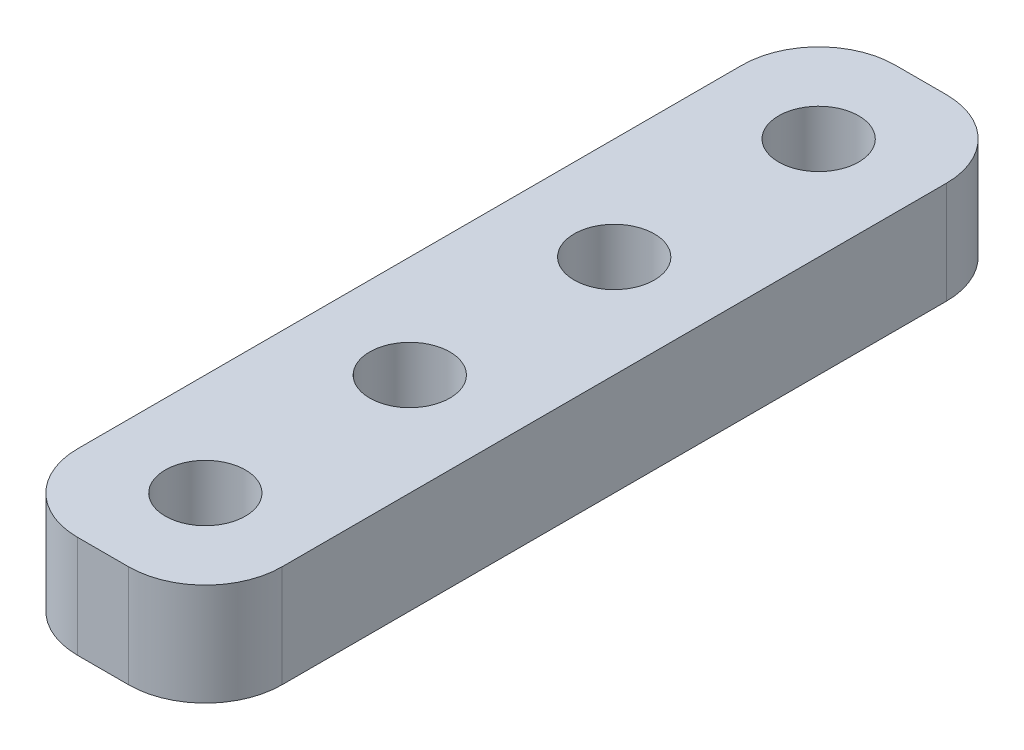
ISO-10303-21;
HEADER;
FILE_DESCRIPTION(('STEP AP214'),'2;1');
FILE_NAME('part.step','',(''),(''),'','','');
FILE_SCHEMA(('AUTOMOTIVE_DESIGN { 1 0 10303 214 1 1 1 1 }'));
ENDSEC;
DATA;
#1=APPLICATION_CONTEXT('core data for automotive mechanical design processes');
#2=APPLICATION_PROTOCOL_DEFINITION('international standard','automotive_design',2000,#1);
#3=PRODUCT_CONTEXT('',#1,'mechanical');
#4=PRODUCT('Part','Part','',(#3));
#5=PRODUCT_RELATED_PRODUCT_CATEGORY('part','',(#4));
#6=PRODUCT_DEFINITION_FORMATION('','',#4);
#7=PRODUCT_DEFINITION_CONTEXT('part definition',#1,'design');
#8=PRODUCT_DEFINITION('design','',#6,#7);
#9=PRODUCT_DEFINITION_SHAPE('','',#8);
#10=(LENGTH_UNIT() NAMED_UNIT(*) SI_UNIT(.MILLI.,.METRE.));
#11=(NAMED_UNIT(*) PLANE_ANGLE_UNIT() SI_UNIT($,.RADIAN.));
#12=(NAMED_UNIT(*) SI_UNIT($,.STERADIAN.) SOLID_ANGLE_UNIT());
#13=UNCERTAINTY_MEASURE_WITH_UNIT(LENGTH_MEASURE(1.E-05),#10,'distance_accuracy_value','');
#14=(GEOMETRIC_REPRESENTATION_CONTEXT(3) GLOBAL_UNCERTAINTY_ASSIGNED_CONTEXT((#13)) GLOBAL_UNIT_ASSIGNED_CONTEXT((#10,
#11,#12)) REPRESENTATION_CONTEXT('',''));
#15=CARTESIAN_POINT('',(0.,0.,0.));
#16=DIRECTION('',(0.,0.,1.));
#17=DIRECTION('',(1.,0.,0.));
#18=AXIS2_PLACEMENT_3D('',#15,#16,#17);
#19=CARTESIAN_POINT('',(6.35,6.35,-44.45));
#20=DIRECTION('',(0.,-1.,0.));
#21=DIRECTION('',(0.,0.,-1.));
#22=AXIS2_PLACEMENT_3D('',#19,#20,#21);
#23=CYLINDRICAL_SURFACE('',#22,2.4892);
#24=CARTESIAN_POINT('',(6.35,6.35,-44.45));
#25=DIRECTION('',(0.,1.,0.));
#26=DIRECTION('',(0.,0.,1.));
#27=AXIS2_PLACEMENT_3D('',#24,#25,#26);
#28=CIRCLE('',#27,2.4892);
#29=CARTESIAN_POINT('',(6.35,6.35,-41.9608));
#30=VERTEX_POINT('',#29);
#31=EDGE_CURVE('E160',#30,#30,#28,.T.);
#32=ORIENTED_EDGE('',*,*,#31,.T.);
#33=EDGE_LOOP('',(#32));
#34=FACE_BOUND('',#33,.T.);
#35=CARTESIAN_POINT('',(6.35,0.,-44.45));
#36=DIRECTION('',(0.,1.,0.));
#37=DIRECTION('',(0.,0.,1.));
#38=AXIS2_PLACEMENT_3D('',#35,#36,#37);
#39=CIRCLE('',#38,2.4892);
#40=CARTESIAN_POINT('',(6.35,0.,-41.9608));
#41=VERTEX_POINT('',#40);
#42=EDGE_CURVE('E163',#41,#41,#39,.T.);
#43=ORIENTED_EDGE('',*,*,#42,.F.);
#44=EDGE_LOOP('',(#43));
#45=FACE_BOUND('',#44,.T.);
#46=ADVANCED_FACE('F39',(#34,#45),#23,.F.);
#47=CARTESIAN_POINT('',(6.35,6.35,-31.75));
#48=DIRECTION('',(0.,-1.,0.));
#49=DIRECTION('',(0.,0.,-1.));
#50=AXIS2_PLACEMENT_3D('',#47,#48,#49);
#51=CYLINDRICAL_SURFACE('',#50,2.4892);
#52=CARTESIAN_POINT('',(6.35,6.35,-31.75));
#53=DIRECTION('',(0.,1.,0.));
#54=DIRECTION('',(0.,0.,1.));
#55=AXIS2_PLACEMENT_3D('',#52,#53,#54);
#56=CIRCLE('',#55,2.4892);
#57=CARTESIAN_POINT('',(6.35,6.35,-29.2608));
#58=VERTEX_POINT('',#57);
#59=EDGE_CURVE('E154',#58,#58,#56,.T.);
#60=ORIENTED_EDGE('',*,*,#59,.T.);
#61=EDGE_LOOP('',(#60));
#62=FACE_BOUND('',#61,.T.);
#63=CARTESIAN_POINT('',(6.35,0.,-31.75));
#64=DIRECTION('',(0.,1.,0.));
#65=DIRECTION('',(0.,0.,1.));
#66=AXIS2_PLACEMENT_3D('',#63,#64,#65);
#67=CIRCLE('',#66,2.4892);
#68=CARTESIAN_POINT('',(6.35,0.,-29.2608));
#69=VERTEX_POINT('',#68);
#70=EDGE_CURVE('E157',#69,#69,#67,.T.);
#71=ORIENTED_EDGE('',*,*,#70,.F.);
#72=EDGE_LOOP('',(#71));
#73=FACE_BOUND('',#72,.T.);
#74=ADVANCED_FACE('F222',(#62,#73),#51,.F.);
#75=CARTESIAN_POINT('',(6.35,6.35,-19.05));
#76=DIRECTION('',(0.,-1.,0.));
#77=DIRECTION('',(0.,0.,-1.));
#78=AXIS2_PLACEMENT_3D('',#75,#76,#77);
#79=CYLINDRICAL_SURFACE('',#78,2.4892);
#80=CARTESIAN_POINT('',(6.35,6.35,-19.05));
#81=DIRECTION('',(0.,1.,0.));
#82=DIRECTION('',(0.,0.,1.));
#83=AXIS2_PLACEMENT_3D('',#80,#81,#82);
#84=CIRCLE('',#83,2.4892);
#85=CARTESIAN_POINT('',(6.35,6.35,-16.5608));
#86=VERTEX_POINT('',#85);
#87=EDGE_CURVE('E148',#86,#86,#84,.T.);
#88=ORIENTED_EDGE('',*,*,#87,.T.);
#89=EDGE_LOOP('',(#88));
#90=FACE_BOUND('',#89,.T.);
#91=CARTESIAN_POINT('',(6.35,0.,-19.05));
#92=DIRECTION('',(0.,1.,0.));
#93=DIRECTION('',(0.,0.,1.));
#94=AXIS2_PLACEMENT_3D('',#91,#92,#93);
#95=CIRCLE('',#94,2.4892);
#96=CARTESIAN_POINT('',(6.35,0.,-16.5608));
#97=VERTEX_POINT('',#96);
#98=EDGE_CURVE('E151',#97,#97,#95,.T.);
#99=ORIENTED_EDGE('',*,*,#98,.F.);
#100=EDGE_LOOP('',(#99));
#101=FACE_BOUND('',#100,.T.);
#102=ADVANCED_FACE('F228',(#90,#101),#79,.F.);
#103=CARTESIAN_POINT('',(0.,6.35,0.));
#104=DIRECTION('',(0.,-1.,0.));
#105=DIRECTION('',(0.,0.,-1.));
#106=AXIS2_PLACEMENT_3D('',#103,#104,#105);
#107=PLANE('',#106);
#108=ORIENTED_EDGE('',*,*,#31,.F.);
#109=EDGE_LOOP('',(#108));
#110=FACE_BOUND('',#109,.T.);
#111=ORIENTED_EDGE('',*,*,#59,.F.);
#112=EDGE_LOOP('',(#111));
#113=FACE_BOUND('',#112,.T.);
#114=ORIENTED_EDGE('',*,*,#87,.F.);
#115=EDGE_LOOP('',(#114));
#116=FACE_BOUND('',#115,.T.);
#117=DIRECTION('',(-1.,0.,0.));
#118=VECTOR('',#117,1.);
#119=CARTESIAN_POINT('',(0.,6.35,-50.8));
#120=LINE('',#119,#118);
#121=CARTESIAN_POINT('',(7.9375,6.35,-50.8));
#122=VERTEX_POINT('',#121);
#123=CARTESIAN_POINT('',(4.7625,6.35,-50.8));
#124=VERTEX_POINT('',#123);
#125=EDGE_CURVE('E142',#122,#124,#120,.T.);
#126=ORIENTED_EDGE('',*,*,#125,.T.);
#127=CARTESIAN_POINT('',(4.7625,6.35,-46.0375));
#128=DIRECTION('',(0.,-1.,0.));
#129=DIRECTION('',(0.,0.,-1.));
#130=AXIS2_PLACEMENT_3D('',#127,#128,#129);
#131=CIRCLE('',#130,4.7625);
#132=CARTESIAN_POINT('',(0.,6.35,-46.0375));
#133=VERTEX_POINT('',#132);
#134=EDGE_CURVE('E179',#124,#133,#131,.F.);
#135=ORIENTED_EDGE('',*,*,#134,.T.);
#136=DIRECTION('',(0.,0.,1.));
#137=VECTOR('',#136,1.);
#138=CARTESIAN_POINT('',(0.,6.35,0.));
#139=LINE('',#138,#137);
#140=CARTESIAN_POINT('',(0.,6.35,-4.7625));
#141=VERTEX_POINT('',#140);
#142=EDGE_CURVE('E125',#133,#141,#139,.T.);
#143=ORIENTED_EDGE('',*,*,#142,.T.);
#144=CARTESIAN_POINT('',(4.7625,6.35,-4.7625));
#145=DIRECTION('',(0.,-1.,0.));
#146=DIRECTION('',(0.,0.,-1.));
#147=AXIS2_PLACEMENT_3D('',#144,#145,#146);
#148=CIRCLE('',#147,4.7625);
#149=CARTESIAN_POINT('',(4.7625,6.35,0.));
#150=VERTEX_POINT('',#149);
#151=EDGE_CURVE('E174',#141,#150,#148,.F.);
#152=ORIENTED_EDGE('',*,*,#151,.T.);
#153=DIRECTION('',(1.,0.,0.));
#154=VECTOR('',#153,1.);
#155=CARTESIAN_POINT('',(0.,6.35,0.));
#156=LINE('',#155,#154);
#157=CARTESIAN_POINT('',(7.9375,6.35,0.));
#158=VERTEX_POINT('',#157);
#159=EDGE_CURVE('E190',#150,#158,#156,.T.);
#160=ORIENTED_EDGE('',*,*,#159,.T.);
#161=CARTESIAN_POINT('',(7.9375,6.35,-4.7625));
#162=DIRECTION('',(0.,-1.,0.));
#163=DIRECTION('',(0.,0.,-1.));
#164=AXIS2_PLACEMENT_3D('',#161,#162,#163);
#165=CIRCLE('',#164,4.7625);
#166=CARTESIAN_POINT('',(12.7,6.35,-4.7625));
#167=VERTEX_POINT('',#166);
#168=EDGE_CURVE('E61',#158,#167,#165,.F.);
#169=ORIENTED_EDGE('',*,*,#168,.T.);
#170=DIRECTION('',(0.,0.,-1.));
#171=VECTOR('',#170,1.);
#172=CARTESIAN_POINT('',(12.7,6.35,0.));
#173=LINE('',#172,#171);
#174=CARTESIAN_POINT('',(12.7,6.35,-46.0375));
#175=VERTEX_POINT('',#174);
#176=EDGE_CURVE('E198',#167,#175,#173,.T.);
#177=ORIENTED_EDGE('',*,*,#176,.T.);
#178=CARTESIAN_POINT('',(7.9375,6.35,-46.0375));
#179=DIRECTION('',(0.,-1.,0.));
#180=DIRECTION('',(0.,0.,-1.));
#181=AXIS2_PLACEMENT_3D('',#178,#179,#180);
#182=CIRCLE('',#181,4.7625);
#183=EDGE_CURVE('E177',#175,#122,#182,.F.);
#184=ORIENTED_EDGE('',*,*,#183,.T.);
#185=EDGE_LOOP('',(#126,#135,#143,#152,#160,#169,#177,#184));
#186=FACE_BOUND('',#185,.T.);
#187=CARTESIAN_POINT('',(6.35,6.35,-6.35));
#188=DIRECTION('',(0.,1.,0.));
#189=DIRECTION('',(0.,0.,1.));
#190=AXIS2_PLACEMENT_3D('',#187,#188,#189);
#191=CIRCLE('',#190,2.4892);
#192=CARTESIAN_POINT('',(6.35,6.35,-3.8608));
#193=VERTEX_POINT('',#192);
#194=EDGE_CURVE('E133',#193,#193,#191,.T.);
#195=ORIENTED_EDGE('',*,*,#194,.F.);
#196=EDGE_LOOP('',(#195));
#197=FACE_BOUND('',#196,.T.);
#198=ADVANCED_FACE('F242',(#110,#113,#116,#186,#197),#107,.F.);
#199=CARTESIAN_POINT('',(0.,0.,0.));
#200=DIRECTION('',(0.,-1.,0.));
#201=DIRECTION('',(0.,0.,-1.));
#202=AXIS2_PLACEMENT_3D('',#199,#200,#201);
#203=PLANE('',#202);
#204=ORIENTED_EDGE('',*,*,#42,.T.);
#205=EDGE_LOOP('',(#204));
#206=FACE_BOUND('',#205,.T.);
#207=ORIENTED_EDGE('',*,*,#70,.T.);
#208=EDGE_LOOP('',(#207));
#209=FACE_BOUND('',#208,.T.);
#210=ORIENTED_EDGE('',*,*,#98,.T.);
#211=EDGE_LOOP('',(#210));
#212=FACE_BOUND('',#211,.T.);
#213=DIRECTION('',(0.,0.,1.));
#214=VECTOR('',#213,1.);
#215=CARTESIAN_POINT('',(0.,0.,0.));
#216=LINE('',#215,#214);
#217=CARTESIAN_POINT('',(0.,0.,-46.0375));
#218=VERTEX_POINT('',#217);
#219=CARTESIAN_POINT('',(0.,0.,-4.7625));
#220=VERTEX_POINT('',#219);
#221=EDGE_CURVE('E122',#218,#220,#216,.T.);
#222=ORIENTED_EDGE('',*,*,#221,.F.);
#223=CARTESIAN_POINT('',(4.7625,0.,-46.0375));
#224=DIRECTION('',(0.,-1.,0.));
#225=DIRECTION('',(0.,0.,-1.));
#226=AXIS2_PLACEMENT_3D('',#223,#224,#225);
#227=CIRCLE('',#226,4.7625);
#228=CARTESIAN_POINT('',(4.7625,0.,-50.8));
#229=VERTEX_POINT('',#228);
#230=EDGE_CURVE('E105',#218,#229,#227,.T.);
#231=ORIENTED_EDGE('',*,*,#230,.T.);
#232=DIRECTION('',(-1.,0.,0.));
#233=VECTOR('',#232,1.);
#234=CARTESIAN_POINT('',(0.,0.,-50.8));
#235=LINE('',#234,#233);
#236=CARTESIAN_POINT('',(7.9375,0.,-50.8));
#237=VERTEX_POINT('',#236);
#238=EDGE_CURVE('E146',#237,#229,#235,.T.);
#239=ORIENTED_EDGE('',*,*,#238,.F.);
#240=CARTESIAN_POINT('',(7.9375,0.,-46.0375));
#241=DIRECTION('',(0.,-1.,0.));
#242=DIRECTION('',(0.,0.,-1.));
#243=AXIS2_PLACEMENT_3D('',#240,#241,#242);
#244=CIRCLE('',#243,4.7625);
#245=CARTESIAN_POINT('',(12.7,0.,-46.0375));
#246=VERTEX_POINT('',#245);
#247=EDGE_CURVE('E116',#237,#246,#244,.T.);
#248=ORIENTED_EDGE('',*,*,#247,.T.);
#249=DIRECTION('',(0.,0.,-1.));
#250=VECTOR('',#249,1.);
#251=CARTESIAN_POINT('',(12.7,0.,0.));
#252=LINE('',#251,#250);
#253=CARTESIAN_POINT('',(12.7,0.,-4.7625));
#254=VERTEX_POINT('',#253);
#255=EDGE_CURVE('E136',#254,#246,#252,.T.);
#256=ORIENTED_EDGE('',*,*,#255,.F.);
#257=CARTESIAN_POINT('',(7.9375,0.,-4.7625));
#258=DIRECTION('',(0.,-1.,0.));
#259=DIRECTION('',(0.,0.,-1.));
#260=AXIS2_PLACEMENT_3D('',#257,#258,#259);
#261=CIRCLE('',#260,4.7625);
#262=CARTESIAN_POINT('',(7.9375,0.,0.));
#263=VERTEX_POINT('',#262);
#264=EDGE_CURVE('E168',#254,#263,#261,.T.);
#265=ORIENTED_EDGE('',*,*,#264,.T.);
#266=DIRECTION('',(1.,0.,0.));
#267=VECTOR('',#266,1.);
#268=CARTESIAN_POINT('',(0.,0.,0.));
#269=LINE('',#268,#267);
#270=CARTESIAN_POINT('',(4.7625,0.,0.));
#271=VERTEX_POINT('',#270);
#272=EDGE_CURVE('E132',#271,#263,#269,.T.);
#273=ORIENTED_EDGE('',*,*,#272,.F.);
#274=CARTESIAN_POINT('',(4.7625,0.,-4.7625));
#275=DIRECTION('',(0.,-1.,0.));
#276=DIRECTION('',(0.,0.,-1.));
#277=AXIS2_PLACEMENT_3D('',#274,#275,#276);
#278=CIRCLE('',#277,4.7625);
#279=EDGE_CURVE('E126',#271,#220,#278,.T.);
#280=ORIENTED_EDGE('',*,*,#279,.T.);
#281=EDGE_LOOP('',(#222,#231,#239,#248,#256,#265,#273,#280));
#282=FACE_BOUND('',#281,.T.);
#283=CARTESIAN_POINT('',(6.35,0.,-6.35));
#284=DIRECTION('',(0.,1.,0.));
#285=DIRECTION('',(0.,0.,1.));
#286=AXIS2_PLACEMENT_3D('',#283,#284,#285);
#287=CIRCLE('',#286,2.4892);
#288=CARTESIAN_POINT('',(6.35,0.,-3.8608));
#289=VERTEX_POINT('',#288);
#290=EDGE_CURVE('E139',#289,#289,#287,.T.);
#291=ORIENTED_EDGE('',*,*,#290,.T.);
#292=EDGE_LOOP('',(#291));
#293=FACE_BOUND('',#292,.T.);
#294=ADVANCED_FACE('F129',(#206,#209,#212,#282,#293),#203,.T.);
#295=CARTESIAN_POINT('',(0.,6.35,0.));
#296=DIRECTION('',(1.,0.,0.));
#297=DIRECTION('',(0.,0.,-1.));
#298=AXIS2_PLACEMENT_3D('',#295,#296,#297);
#299=PLANE('',#298);
#300=ORIENTED_EDGE('',*,*,#142,.F.);
#301=DIRECTION('',(0.,-1.,0.));
#302=VECTOR('',#301,1.);
#303=CARTESIAN_POINT('',(0.,6.35,-46.0375));
#304=LINE('',#303,#302);
#305=EDGE_CURVE('E109',#133,#218,#304,.T.);
#306=ORIENTED_EDGE('',*,*,#305,.T.);
#307=ORIENTED_EDGE('',*,*,#221,.T.);
#308=DIRECTION('',(0.,-1.,0.));
#309=VECTOR('',#308,1.);
#310=CARTESIAN_POINT('',(0.,6.35,-4.7625));
#311=LINE('',#310,#309);
#312=EDGE_CURVE('E127',#220,#141,#311,.F.);
#313=ORIENTED_EDGE('',*,*,#312,.T.);
#314=EDGE_LOOP('',(#300,#306,#307,#313));
#315=FACE_BOUND('',#314,.T.);
#316=ADVANCED_FACE('F121',(#315),#299,.F.);
#317=CARTESIAN_POINT('',(0.,6.35,0.));
#318=DIRECTION('',(0.,0.,-1.));
#319=DIRECTION('',(-1.,0.,0.));
#320=AXIS2_PLACEMENT_3D('',#317,#318,#319);
#321=PLANE('',#320);
#322=ORIENTED_EDGE('',*,*,#272,.T.);
#323=DIRECTION('',(0.,-1.,0.));
#324=VECTOR('',#323,1.);
#325=CARTESIAN_POINT('',(7.9375,6.35,0.));
#326=LINE('',#325,#324);
#327=EDGE_CURVE('E11',#263,#158,#326,.F.);
#328=ORIENTED_EDGE('',*,*,#327,.T.);
#329=ORIENTED_EDGE('',*,*,#159,.F.);
#330=DIRECTION('',(0.,-1.,0.));
#331=VECTOR('',#330,1.);
#332=CARTESIAN_POINT('',(4.7625,6.35,0.));
#333=LINE('',#332,#331);
#334=EDGE_CURVE('E47',#150,#271,#333,.T.);
#335=ORIENTED_EDGE('',*,*,#334,.T.);
#336=EDGE_LOOP('',(#322,#328,#329,#335));
#337=FACE_BOUND('',#336,.T.);
#338=ADVANCED_FACE('F188',(#337),#321,.F.);
#339=CARTESIAN_POINT('',(12.7,6.35,0.));
#340=DIRECTION('',(-1.,0.,0.));
#341=DIRECTION('',(0.,0.,1.));
#342=AXIS2_PLACEMENT_3D('',#339,#340,#341);
#343=PLANE('',#342);
#344=ORIENTED_EDGE('',*,*,#255,.T.);
#345=DIRECTION('',(0.,-1.,0.));
#346=VECTOR('',#345,1.);
#347=CARTESIAN_POINT('',(12.7,6.35,-46.0375));
#348=LINE('',#347,#346);
#349=EDGE_CURVE('E54',#246,#175,#348,.F.);
#350=ORIENTED_EDGE('',*,*,#349,.T.);
#351=ORIENTED_EDGE('',*,*,#176,.F.);
#352=DIRECTION('',(0.,-1.,0.));
#353=VECTOR('',#352,1.);
#354=CARTESIAN_POINT('',(12.7,6.35,-4.7625));
#355=LINE('',#354,#353);
#356=EDGE_CURVE('E181',#167,#254,#355,.T.);
#357=ORIENTED_EDGE('',*,*,#356,.T.);
#358=EDGE_LOOP('',(#344,#350,#351,#357));
#359=FACE_BOUND('',#358,.T.);
#360=ADVANCED_FACE('F197',(#359),#343,.F.);
#361=CARTESIAN_POINT('',(0.,6.35,-50.8));
#362=DIRECTION('',(0.,0.,1.));
#363=DIRECTION('',(1.,0.,0.));
#364=AXIS2_PLACEMENT_3D('',#361,#362,#363);
#365=PLANE('',#364);
#366=ORIENTED_EDGE('',*,*,#238,.T.);
#367=DIRECTION('',(0.,-1.,0.));
#368=VECTOR('',#367,1.);
#369=CARTESIAN_POINT('',(4.7625,6.35,-50.8));
#370=LINE('',#369,#368);
#371=EDGE_CURVE('E110',#229,#124,#370,.F.);
#372=ORIENTED_EDGE('',*,*,#371,.T.);
#373=ORIENTED_EDGE('',*,*,#125,.F.);
#374=DIRECTION('',(0.,-1.,0.));
#375=VECTOR('',#374,1.);
#376=CARTESIAN_POINT('',(7.9375,6.35,-50.8));
#377=LINE('',#376,#375);
#378=EDGE_CURVE('E115',#122,#237,#377,.T.);
#379=ORIENTED_EDGE('',*,*,#378,.T.);
#380=EDGE_LOOP('',(#366,#372,#373,#379));
#381=FACE_BOUND('',#380,.T.);
#382=ADVANCED_FACE('F209',(#381),#365,.F.);
#383=CARTESIAN_POINT('',(6.35,6.35,-6.35));
#384=DIRECTION('',(0.,-1.,0.));
#385=DIRECTION('',(0.,0.,-1.));
#386=AXIS2_PLACEMENT_3D('',#383,#384,#385);
#387=CYLINDRICAL_SURFACE('',#386,2.4892);
#388=ORIENTED_EDGE('',*,*,#194,.T.);
#389=EDGE_LOOP('',(#388));
#390=FACE_BOUND('',#389,.T.);
#391=ORIENTED_EDGE('',*,*,#290,.F.);
#392=EDGE_LOOP('',(#391));
#393=FACE_BOUND('',#392,.T.);
#394=ADVANCED_FACE('F207',(#390,#393),#387,.F.);
#395=CARTESIAN_POINT('',(4.7625,6.35,-46.0375));
#396=DIRECTION('',(0.,-1.,0.));
#397=DIRECTION('',(0.,0.,-1.));
#398=AXIS2_PLACEMENT_3D('',#395,#396,#397);
#399=CYLINDRICAL_SURFACE('',#398,4.7625);
#400=ORIENTED_EDGE('',*,*,#134,.F.);
#401=ORIENTED_EDGE('',*,*,#371,.F.);
#402=ORIENTED_EDGE('',*,*,#230,.F.);
#403=ORIENTED_EDGE('',*,*,#305,.F.);
#404=EDGE_LOOP('',(#400,#401,#402,#403));
#405=FACE_BOUND('',#404,.T.);
#406=ADVANCED_FACE('F108',(#405),#399,.T.);
#407=CARTESIAN_POINT('',(7.9375,6.35,-46.0375));
#408=DIRECTION('',(0.,-1.,0.));
#409=DIRECTION('',(0.,0.,-1.));
#410=AXIS2_PLACEMENT_3D('',#407,#408,#409);
#411=CYLINDRICAL_SURFACE('',#410,4.7625);
#412=ORIENTED_EDGE('',*,*,#183,.F.);
#413=ORIENTED_EDGE('',*,*,#349,.F.);
#414=ORIENTED_EDGE('',*,*,#247,.F.);
#415=ORIENTED_EDGE('',*,*,#378,.F.);
#416=EDGE_LOOP('',(#412,#413,#414,#415));
#417=FACE_BOUND('',#416,.T.);
#418=ADVANCED_FACE('F216',(#417),#411,.T.);
#419=CARTESIAN_POINT('',(7.9375,6.35,-4.7625));
#420=DIRECTION('',(0.,-1.,0.));
#421=DIRECTION('',(0.,0.,-1.));
#422=AXIS2_PLACEMENT_3D('',#419,#420,#421);
#423=CYLINDRICAL_SURFACE('',#422,4.7625);
#424=ORIENTED_EDGE('',*,*,#168,.F.);
#425=ORIENTED_EDGE('',*,*,#327,.F.);
#426=ORIENTED_EDGE('',*,*,#264,.F.);
#427=ORIENTED_EDGE('',*,*,#356,.F.);
#428=EDGE_LOOP('',(#424,#425,#426,#427));
#429=FACE_BOUND('',#428,.T.);
#430=ADVANCED_FACE('F196',(#429),#423,.T.);
#431=CARTESIAN_POINT('',(4.7625,6.35,-4.7625));
#432=DIRECTION('',(0.,-1.,0.));
#433=DIRECTION('',(0.,0.,-1.));
#434=AXIS2_PLACEMENT_3D('',#431,#432,#433);
#435=CYLINDRICAL_SURFACE('',#434,4.7625);
#436=ORIENTED_EDGE('',*,*,#151,.F.);
#437=ORIENTED_EDGE('',*,*,#312,.F.);
#438=ORIENTED_EDGE('',*,*,#279,.F.);
#439=ORIENTED_EDGE('',*,*,#334,.F.);
#440=EDGE_LOOP('',(#436,#437,#438,#439));
#441=FACE_BOUND('',#440,.T.);
#442=ADVANCED_FACE('F41',(#441),#435,.T.);
#443=CLOSED_SHELL('',(#46,#74,#102,#198,#294,#316,#338,#360,#382,#394,#406,#418,#430,#442));
#444=MANIFOLD_SOLID_BREP('B2',#443);
#445=ADVANCED_BREP_SHAPE_REPRESENTATION('',(#18,#444),#14);
#446=SHAPE_DEFINITION_REPRESENTATION(#9,#445);
ENDSEC;
END-ISO-10303-21;
